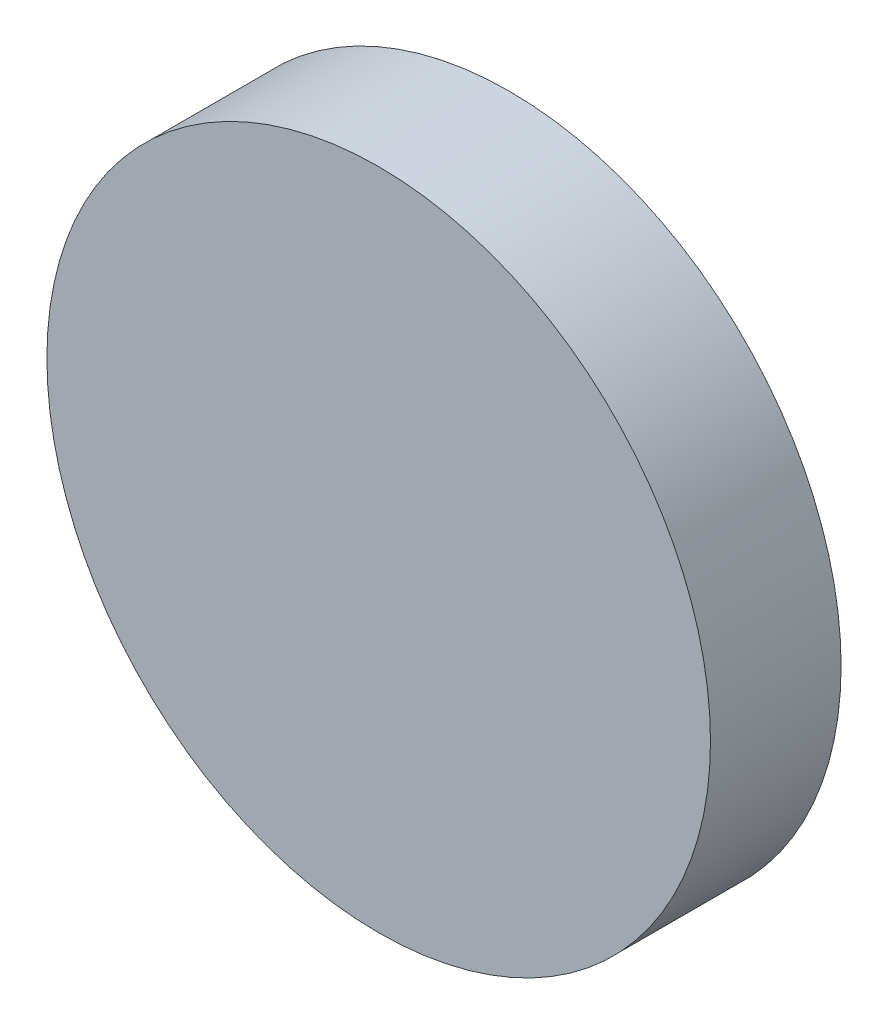
ISO-10303-21;
HEADER;
FILE_DESCRIPTION(('STEP AP214'),'2;1');
FILE_NAME('part.step','',(''),(''),'','','');
FILE_SCHEMA(('AUTOMOTIVE_DESIGN { 1 0 10303 214 1 1 1 1 }'));
ENDSEC;
DATA;
#1=APPLICATION_CONTEXT('core data for automotive mechanical design processes');
#2=APPLICATION_PROTOCOL_DEFINITION('international standard','automotive_design',2000,#1);
#3=PRODUCT_CONTEXT('',#1,'mechanical');
#4=PRODUCT('Part','Part','',(#3));
#5=PRODUCT_RELATED_PRODUCT_CATEGORY('part','',(#4));
#6=PRODUCT_DEFINITION_FORMATION('','',#4);
#7=PRODUCT_DEFINITION_CONTEXT('part definition',#1,'design');
#8=PRODUCT_DEFINITION('design','',#6,#7);
#9=PRODUCT_DEFINITION_SHAPE('','',#8);
#10=(LENGTH_UNIT() NAMED_UNIT(*) SI_UNIT(.MILLI.,.METRE.));
#11=(NAMED_UNIT(*) PLANE_ANGLE_UNIT() SI_UNIT($,.RADIAN.));
#12=(NAMED_UNIT(*) SI_UNIT($,.STERADIAN.) SOLID_ANGLE_UNIT());
#13=UNCERTAINTY_MEASURE_WITH_UNIT(LENGTH_MEASURE(1.E-05),#10,'distance_accuracy_value','');
#14=(GEOMETRIC_REPRESENTATION_CONTEXT(3) GLOBAL_UNCERTAINTY_ASSIGNED_CONTEXT((#13)) GLOBAL_UNIT_ASSIGNED_CONTEXT((#10,
#11,#12)) REPRESENTATION_CONTEXT('',''));
#15=CARTESIAN_POINT('',(0.,0.,0.));
#16=DIRECTION('',(0.,0.,1.));
#17=DIRECTION('',(1.,0.,0.));
#18=AXIS2_PLACEMENT_3D('',#15,#16,#17);
#19=CARTESIAN_POINT('',(0.,0.,5.));
#20=DIRECTION('',(0.,0.,-1.));
#21=DIRECTION('',(-1.,0.,0.));
#22=AXIS2_PLACEMENT_3D('',#19,#20,#21);
#23=CYLINDRICAL_SURFACE('',#22,12.7);
#24=CARTESIAN_POINT('',(0.,0.,5.));
#25=DIRECTION('',(0.,0.,1.));
#26=DIRECTION('',(1.,0.,0.));
#27=AXIS2_PLACEMENT_3D('',#24,#25,#26);
#28=CIRCLE('',#27,12.7);
#29=CARTESIAN_POINT('',(12.7,0.,5.));
#30=VERTEX_POINT('',#29);
#31=EDGE_CURVE('E10',#30,#30,#28,.T.);
#32=ORIENTED_EDGE('',*,*,#31,.F.);
#33=EDGE_LOOP('',(#32));
#34=FACE_BOUND('',#33,.T.);
#35=CARTESIAN_POINT('',(0.,0.,0.));
#36=DIRECTION('',(0.,0.,1.));
#37=DIRECTION('',(1.,0.,0.));
#38=AXIS2_PLACEMENT_3D('',#35,#36,#37);
#39=CIRCLE('',#38,12.7);
#40=CARTESIAN_POINT('',(12.7,0.,0.));
#41=VERTEX_POINT('',#40);
#42=EDGE_CURVE('E45',#41,#41,#39,.T.);
#43=ORIENTED_EDGE('',*,*,#42,.T.);
#44=EDGE_LOOP('',(#43));
#45=FACE_BOUND('',#44,.T.);
#46=ADVANCED_FACE('F39',(#34,#45),#23,.T.);
#47=CARTESIAN_POINT('',(0.,0.,5.));
#48=DIRECTION('',(0.,0.,1.));
#49=DIRECTION('',(1.,0.,0.));
#50=AXIS2_PLACEMENT_3D('',#47,#48,#49);
#51=PLANE('',#50);
#52=ORIENTED_EDGE('',*,*,#31,.T.);
#53=EDGE_LOOP('',(#52));
#54=FACE_BOUND('',#53,.T.);
#55=ADVANCED_FACE('F68',(#54),#51,.T.);
#56=CARTESIAN_POINT('',(0.,0.,0.));
#57=DIRECTION('',(0.,0.,1.));
#58=DIRECTION('',(1.,0.,0.));
#59=AXIS2_PLACEMENT_3D('',#56,#57,#58);
#60=PLANE('',#59);
#61=CARTESIAN_POINT('',(0.,0.,0.));
#62=DIRECTION('',(0.,0.,1.));
#63=DIRECTION('',(1.,0.,0.));
#64=AXIS2_PLACEMENT_3D('',#61,#62,#63);
#65=CIRCLE('',#64,6.);
#66=CARTESIAN_POINT('',(6.,0.,0.));
#67=VERTEX_POINT('',#66);
#68=EDGE_CURVE('E51',#67,#67,#65,.T.);
#69=ORIENTED_EDGE('',*,*,#68,.T.);
#70=EDGE_LOOP('',(#69));
#71=FACE_BOUND('',#70,.T.);
#72=ORIENTED_EDGE('',*,*,#42,.F.);
#73=EDGE_LOOP('',(#72));
#74=FACE_BOUND('',#73,.T.);
#75=ADVANCED_FACE('F69',(#71,#74),#60,.F.);
#76=CARTESIAN_POINT('',(0.,0.,-4.2));
#77=DIRECTION('',(0.,0.,1.));
#78=DIRECTION('',(1.,0.,0.));
#79=AXIS2_PLACEMENT_3D('',#76,#77,#78);
#80=CYLINDRICAL_SURFACE('',#79,6.);
#81=CARTESIAN_POINT('',(0.,0.,-4.2));
#82=DIRECTION('',(0.,0.,1.));
#83=DIRECTION('',(1.,0.,0.));
#84=AXIS2_PLACEMENT_3D('',#81,#82,#83);
#85=CIRCLE('',#84,6.);
#86=CARTESIAN_POINT('',(6.,0.,-4.2));
#87=VERTEX_POINT('',#86);
#88=EDGE_CURVE('E47',#87,#87,#85,.T.);
#89=ORIENTED_EDGE('',*,*,#88,.T.);
#90=EDGE_LOOP('',(#89));
#91=FACE_BOUND('',#90,.T.);
#92=ORIENTED_EDGE('',*,*,#68,.F.);
#93=EDGE_LOOP('',(#92));
#94=FACE_BOUND('',#93,.T.);
#95=ADVANCED_FACE('F60',(#91,#94),#80,.T.);
#96=CARTESIAN_POINT('',(0.,0.,-4.2));
#97=DIRECTION('',(0.,0.,1.));
#98=DIRECTION('',(1.,0.,0.));
#99=AXIS2_PLACEMENT_3D('',#96,#97,#98);
#100=PLANE('',#99);
#101=ORIENTED_EDGE('',*,*,#88,.F.);
#102=EDGE_LOOP('',(#101));
#103=FACE_BOUND('',#102,.T.);
#104=ADVANCED_FACE('F58',(#103),#100,.F.);
#105=CLOSED_SHELL('',(#46,#55,#75,#95,#104));
#106=MANIFOLD_SOLID_BREP('B2',#105);
#107=ADVANCED_BREP_SHAPE_REPRESENTATION('',(#18,#106),#14);
#108=SHAPE_DEFINITION_REPRESENTATION(#9,#107);
ENDSEC;
END-ISO-10303-21;
